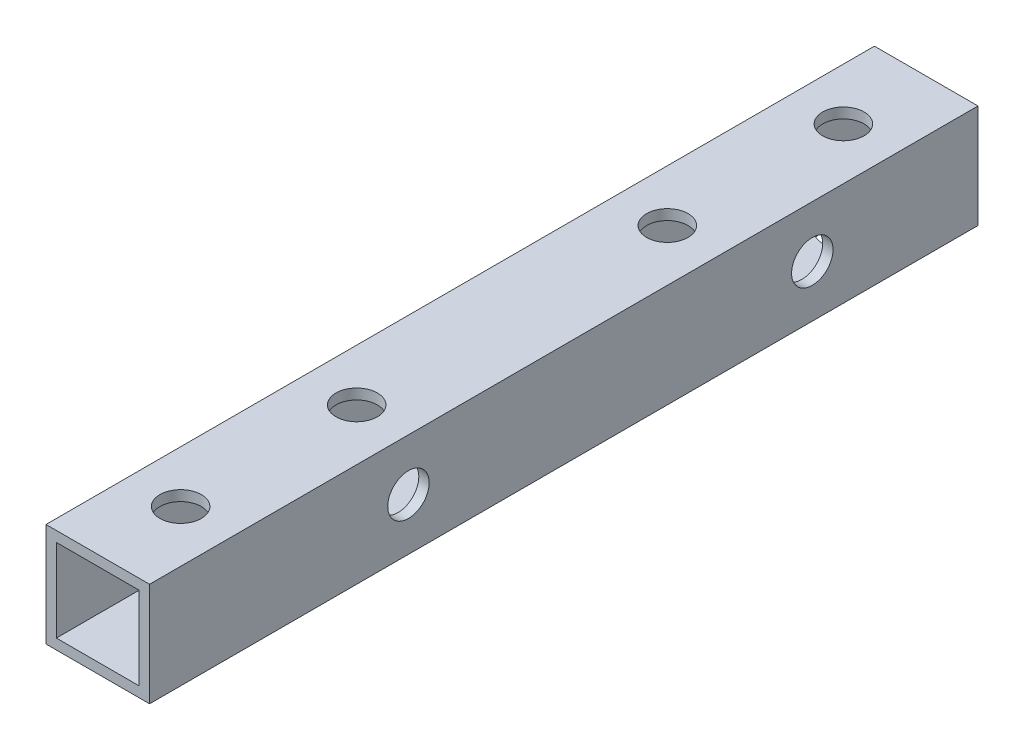
ISO-10303-21;
HEADER;
FILE_DESCRIPTION(('STEP AP214'),'2;1');
FILE_NAME('part.step','',(''),(''),'','','');
FILE_SCHEMA(('AUTOMOTIVE_DESIGN { 1 0 10303 214 1 1 1 1 }'));
ENDSEC;
DATA;
#1=APPLICATION_CONTEXT('core data for automotive mechanical design processes');
#2=APPLICATION_PROTOCOL_DEFINITION('international standard','automotive_design',2000,#1);
#3=PRODUCT_CONTEXT('',#1,'mechanical');
#4=PRODUCT('Part','Part','',(#3));
#5=PRODUCT_RELATED_PRODUCT_CATEGORY('part','',(#4));
#6=PRODUCT_DEFINITION_FORMATION('','',#4);
#7=PRODUCT_DEFINITION_CONTEXT('part definition',#1,'design');
#8=PRODUCT_DEFINITION('design','',#6,#7);
#9=PRODUCT_DEFINITION_SHAPE('','',#8);
#10=(LENGTH_UNIT() NAMED_UNIT(*) SI_UNIT(.MILLI.,.METRE.));
#11=(NAMED_UNIT(*) PLANE_ANGLE_UNIT() SI_UNIT($,.RADIAN.));
#12=(NAMED_UNIT(*) SI_UNIT($,.STERADIAN.) SOLID_ANGLE_UNIT());
#13=UNCERTAINTY_MEASURE_WITH_UNIT(LENGTH_MEASURE(1.E-05),#10,'distance_accuracy_value','');
#14=(GEOMETRIC_REPRESENTATION_CONTEXT(3) GLOBAL_UNCERTAINTY_ASSIGNED_CONTEXT((#13)) GLOBAL_UNIT_ASSIGNED_CONTEXT((#10,
#11,#12)) REPRESENTATION_CONTEXT('',''));
#15=CARTESIAN_POINT('',(0.,0.,0.));
#16=DIRECTION('',(0.,0.,1.));
#17=DIRECTION('',(1.,0.,0.));
#18=AXIS2_PLACEMENT_3D('',#15,#16,#17);
#19=CARTESIAN_POINT('',(0.,0.,80.));
#20=DIRECTION('',(0.,0.,-1.));
#21=DIRECTION('',(-1.,0.,0.));
#22=AXIS2_PLACEMENT_3D('',#19,#20,#21);
#23=PLANE('',#22);
#24=DIRECTION('',(1.,0.,0.));
#25=VECTOR('',#24,1.);
#26=CARTESIAN_POINT('',(10.,0.,80.));
#27=LINE('',#26,#25);
#28=CARTESIAN_POINT('',(0.,0.,80.));
#29=VERTEX_POINT('',#28);
#30=CARTESIAN_POINT('',(10.,0.,80.));
#31=VERTEX_POINT('',#30);
#32=EDGE_CURVE('E139',#29,#31,#27,.T.);
#33=ORIENTED_EDGE('',*,*,#32,.T.);
#34=DIRECTION('',(0.,1.,0.));
#35=VECTOR('',#34,1.);
#36=CARTESIAN_POINT('',(10.,10.,80.));
#37=LINE('',#36,#35);
#38=CARTESIAN_POINT('',(10.,10.,80.));
#39=VERTEX_POINT('',#38);
#40=EDGE_CURVE('E142',#31,#39,#37,.T.);
#41=ORIENTED_EDGE('',*,*,#40,.T.);
#42=DIRECTION('',(-1.,0.,0.));
#43=VECTOR('',#42,1.);
#44=CARTESIAN_POINT('',(0.,10.,80.));
#45=LINE('',#44,#43);
#46=CARTESIAN_POINT('',(0.,10.,80.));
#47=VERTEX_POINT('',#46);
#48=EDGE_CURVE('E145',#39,#47,#45,.T.);
#49=ORIENTED_EDGE('',*,*,#48,.T.);
#50=DIRECTION('',(0.,-1.,0.));
#51=VECTOR('',#50,1.);
#52=CARTESIAN_POINT('',(0.,0.,80.));
#53=LINE('',#52,#51);
#54=EDGE_CURVE('E147',#47,#29,#53,.T.);
#55=ORIENTED_EDGE('',*,*,#54,.T.);
#56=EDGE_LOOP('',(#33,#41,#49,#55));
#57=FACE_BOUND('',#56,.T.);
#58=DIRECTION('',(0.,-1.,0.));
#59=VECTOR('',#58,1.);
#60=CARTESIAN_POINT('',(1.,0.999999999999999,80.));
#61=LINE('',#60,#59);
#62=CARTESIAN_POINT('',(1.,9.,80.));
#63=VERTEX_POINT('',#62);
#64=CARTESIAN_POINT('',(1.,0.999999999999999,80.));
#65=VERTEX_POINT('',#64);
#66=EDGE_CURVE('E101',#63,#65,#61,.T.);
#67=ORIENTED_EDGE('',*,*,#66,.F.);
#68=DIRECTION('',(-1.,0.,0.));
#69=VECTOR('',#68,1.);
#70=CARTESIAN_POINT('',(1.,9.,80.));
#71=LINE('',#70,#69);
#72=CARTESIAN_POINT('',(9.,9.,80.));
#73=VERTEX_POINT('',#72);
#74=EDGE_CURVE('E123',#73,#63,#71,.T.);
#75=ORIENTED_EDGE('',*,*,#74,.F.);
#76=DIRECTION('',(0.,1.,0.));
#77=VECTOR('',#76,1.);
#78=CARTESIAN_POINT('',(9.,9.,80.));
#79=LINE('',#78,#77);
#80=CARTESIAN_POINT('',(9.,1.,80.));
#81=VERTEX_POINT('',#80);
#82=EDGE_CURVE('E121',#81,#73,#79,.T.);
#83=ORIENTED_EDGE('',*,*,#82,.F.);
#84=DIRECTION('',(1.,0.,0.));
#85=VECTOR('',#84,1.);
#86=CARTESIAN_POINT('',(9.,1.,80.));
#87=LINE('',#86,#85);
#88=EDGE_CURVE('E109',#65,#81,#87,.T.);
#89=ORIENTED_EDGE('',*,*,#88,.F.);
#90=EDGE_LOOP('',(#67,#75,#83,#89));
#91=FACE_BOUND('',#90,.T.);
#92=ADVANCED_FACE('F34',(#57,#91),#23,.F.);
#93=CARTESIAN_POINT('',(0.,0.,0.));
#94=DIRECTION('',(0.,0.,-1.));
#95=DIRECTION('',(-1.,0.,0.));
#96=AXIS2_PLACEMENT_3D('',#93,#94,#95);
#97=PLANE('',#96);
#98=DIRECTION('',(1.,0.,0.));
#99=VECTOR('',#98,1.);
#100=CARTESIAN_POINT('',(10.,0.,0.));
#101=LINE('',#100,#99);
#102=CARTESIAN_POINT('',(0.,0.,0.));
#103=VERTEX_POINT('',#102);
#104=CARTESIAN_POINT('',(10.,0.,0.));
#105=VERTEX_POINT('',#104);
#106=EDGE_CURVE('E117',#103,#105,#101,.T.);
#107=ORIENTED_EDGE('',*,*,#106,.F.);
#108=DIRECTION('',(0.,-1.,0.));
#109=VECTOR('',#108,1.);
#110=CARTESIAN_POINT('',(0.,0.,0.));
#111=LINE('',#110,#109);
#112=CARTESIAN_POINT('',(0.,10.,0.));
#113=VERTEX_POINT('',#112);
#114=EDGE_CURVE('E143',#113,#103,#111,.T.);
#115=ORIENTED_EDGE('',*,*,#114,.F.);
#116=DIRECTION('',(-1.,0.,0.));
#117=VECTOR('',#116,1.);
#118=CARTESIAN_POINT('',(0.,10.,0.));
#119=LINE('',#118,#117);
#120=CARTESIAN_POINT('',(10.,10.,0.));
#121=VERTEX_POINT('',#120);
#122=EDGE_CURVE('E154',#121,#113,#119,.T.);
#123=ORIENTED_EDGE('',*,*,#122,.F.);
#124=DIRECTION('',(0.,1.,0.));
#125=VECTOR('',#124,1.);
#126=CARTESIAN_POINT('',(10.,10.,0.));
#127=LINE('',#126,#125);
#128=EDGE_CURVE('E152',#105,#121,#127,.T.);
#129=ORIENTED_EDGE('',*,*,#128,.F.);
#130=EDGE_LOOP('',(#107,#115,#123,#129));
#131=FACE_BOUND('',#130,.T.);
#132=DIRECTION('',(-1.,0.,0.));
#133=VECTOR('',#132,1.);
#134=CARTESIAN_POINT('',(1.,9.,0.));
#135=LINE('',#134,#133);
#136=CARTESIAN_POINT('',(9.,9.,0.));
#137=VERTEX_POINT('',#136);
#138=CARTESIAN_POINT('',(1.,9.,0.));
#139=VERTEX_POINT('',#138);
#140=EDGE_CURVE('E110',#137,#139,#135,.T.);
#141=ORIENTED_EDGE('',*,*,#140,.T.);
#142=DIRECTION('',(0.,-1.,0.));
#143=VECTOR('',#142,1.);
#144=CARTESIAN_POINT('',(1.,0.999999999999999,0.));
#145=LINE('',#144,#143);
#146=CARTESIAN_POINT('',(1.,0.999999999999999,0.));
#147=VERTEX_POINT('',#146);
#148=EDGE_CURVE('E59',#139,#147,#145,.T.);
#149=ORIENTED_EDGE('',*,*,#148,.T.);
#150=DIRECTION('',(1.,0.,0.));
#151=VECTOR('',#150,1.);
#152=CARTESIAN_POINT('',(9.,1.,0.));
#153=LINE('',#152,#151);
#154=CARTESIAN_POINT('',(9.,1.,0.));
#155=VERTEX_POINT('',#154);
#156=EDGE_CURVE('E116',#147,#155,#153,.T.);
#157=ORIENTED_EDGE('',*,*,#156,.T.);
#158=DIRECTION('',(0.,1.,0.));
#159=VECTOR('',#158,1.);
#160=CARTESIAN_POINT('',(9.,9.,0.));
#161=LINE('',#160,#159);
#162=EDGE_CURVE('E131',#155,#137,#161,.T.);
#163=ORIENTED_EDGE('',*,*,#162,.T.);
#164=EDGE_LOOP('',(#141,#149,#157,#163));
#165=FACE_BOUND('',#164,.T.);
#166=ADVANCED_FACE('F252',(#131,#165),#97,.T.);
#167=CARTESIAN_POINT('',(10.,0.,80.));
#168=DIRECTION('',(0.,1.,0.));
#169=DIRECTION('',(-1.,0.,0.));
#170=AXIS2_PLACEMENT_3D('',#167,#168,#169);
#171=PLANE('',#170);
#172=CARTESIAN_POINT('',(5.,0.,55.));
#173=DIRECTION('',(0.,-1.,0.));
#174=DIRECTION('',(1.,0.,0.));
#175=AXIS2_PLACEMENT_3D('',#172,#173,#174);
#176=CIRCLE('',#175,2.);
#177=CARTESIAN_POINT('',(7.,0.,55.));
#178=VERTEX_POINT('',#177);
#179=EDGE_CURVE('E182',#178,#178,#176,.T.);
#180=ORIENTED_EDGE('',*,*,#179,.F.);
#181=EDGE_LOOP('',(#180));
#182=FACE_BOUND('',#181,.T.);
#183=CARTESIAN_POINT('',(5.,0.,25.));
#184=DIRECTION('',(0.,-1.,0.));
#185=DIRECTION('',(1.,0.,0.));
#186=AXIS2_PLACEMENT_3D('',#183,#184,#185);
#187=CIRCLE('',#186,2.);
#188=CARTESIAN_POINT('',(7.,0.,25.));
#189=VERTEX_POINT('',#188);
#190=EDGE_CURVE('E178',#189,#189,#187,.T.);
#191=ORIENTED_EDGE('',*,*,#190,.F.);
#192=EDGE_LOOP('',(#191));
#193=FACE_BOUND('',#192,.T.);
#194=CARTESIAN_POINT('',(5.,0.,72.));
#195=DIRECTION('',(0.,1.,0.));
#196=DIRECTION('',(-1.,0.,0.));
#197=AXIS2_PLACEMENT_3D('',#194,#195,#196);
#198=CIRCLE('',#197,2.);
#199=CARTESIAN_POINT('',(3.,0.,72.));
#200=VERTEX_POINT('',#199);
#201=EDGE_CURVE('E129',#200,#200,#198,.T.);
#202=ORIENTED_EDGE('',*,*,#201,.T.);
#203=EDGE_LOOP('',(#202));
#204=FACE_BOUND('',#203,.T.);
#205=CARTESIAN_POINT('',(5.00000000000001,0.,8.));
#206=DIRECTION('',(0.,1.,0.));
#207=DIRECTION('',(-1.,0.,0.));
#208=AXIS2_PLACEMENT_3D('',#205,#206,#207);
#209=CIRCLE('',#208,2.);
#210=CARTESIAN_POINT('',(3.,0.,8.));
#211=VERTEX_POINT('',#210);
#212=EDGE_CURVE('E173',#211,#211,#209,.T.);
#213=ORIENTED_EDGE('',*,*,#212,.T.);
#214=EDGE_LOOP('',(#213));
#215=FACE_BOUND('',#214,.T.);
#216=ORIENTED_EDGE('',*,*,#106,.T.);
#217=DIRECTION('',(0.,0.,-1.));
#218=VECTOR('',#217,1.);
#219=CARTESIAN_POINT('',(10.,0.,80.));
#220=LINE('',#219,#218);
#221=EDGE_CURVE('E11',#31,#105,#220,.T.);
#222=ORIENTED_EDGE('',*,*,#221,.F.);
#223=ORIENTED_EDGE('',*,*,#32,.F.);
#224=DIRECTION('',(0.,0.,-1.));
#225=VECTOR('',#224,1.);
#226=CARTESIAN_POINT('',(0.,0.,80.));
#227=LINE('',#226,#225);
#228=EDGE_CURVE('E149',#29,#103,#227,.T.);
#229=ORIENTED_EDGE('',*,*,#228,.T.);
#230=EDGE_LOOP('',(#216,#222,#223,#229));
#231=FACE_BOUND('',#230,.T.);
#232=ADVANCED_FACE('F36',(#182,#193,#204,#215,#231),#171,.F.);
#233=CARTESIAN_POINT('',(10.,10.,80.));
#234=DIRECTION('',(-1.,0.,0.));
#235=DIRECTION('',(0.,-1.,0.));
#236=AXIS2_PLACEMENT_3D('',#233,#234,#235);
#237=PLANE('',#236);
#238=CARTESIAN_POINT('',(10.,5.,55.));
#239=DIRECTION('',(-1.,0.,0.));
#240=DIRECTION('',(0.,-1.,0.));
#241=AXIS2_PLACEMENT_3D('',#238,#239,#240);
#242=CIRCLE('',#241,2.);
#243=CARTESIAN_POINT('',(10.,3.00000000000001,55.));
#244=VERTEX_POINT('',#243);
#245=EDGE_CURVE('E281',#244,#244,#242,.T.);
#246=ORIENTED_EDGE('',*,*,#245,.T.);
#247=EDGE_LOOP('',(#246));
#248=FACE_BOUND('',#247,.T.);
#249=CARTESIAN_POINT('',(10.,5.,16.));
#250=DIRECTION('',(1.,0.,0.));
#251=DIRECTION('',(0.,1.,0.));
#252=AXIS2_PLACEMENT_3D('',#249,#250,#251);
#253=CIRCLE('',#252,2.);
#254=CARTESIAN_POINT('',(10.,7.,16.));
#255=VERTEX_POINT('',#254);
#256=EDGE_CURVE('E186',#255,#255,#253,.T.);
#257=ORIENTED_EDGE('',*,*,#256,.F.);
#258=EDGE_LOOP('',(#257));
#259=FACE_BOUND('',#258,.T.);
#260=ORIENTED_EDGE('',*,*,#128,.T.);
#261=DIRECTION('',(0.,0.,-1.));
#262=VECTOR('',#261,1.);
#263=CARTESIAN_POINT('',(10.,10.,80.));
#264=LINE('',#263,#262);
#265=EDGE_CURVE('E43',#39,#121,#264,.T.);
#266=ORIENTED_EDGE('',*,*,#265,.F.);
#267=ORIENTED_EDGE('',*,*,#40,.F.);
#268=ORIENTED_EDGE('',*,*,#221,.T.);
#269=EDGE_LOOP('',(#260,#266,#267,#268));
#270=FACE_BOUND('',#269,.T.);
#271=ADVANCED_FACE('F269',(#248,#259,#270),#237,.F.);
#272=CARTESIAN_POINT('',(0.,10.,80.));
#273=DIRECTION('',(0.,-1.,0.));
#274=DIRECTION('',(1.,0.,0.));
#275=AXIS2_PLACEMENT_3D('',#272,#273,#274);
#276=PLANE('',#275);
#277=CARTESIAN_POINT('',(5.,9.99999999999999,55.));
#278=DIRECTION('',(0.,-1.,0.));
#279=DIRECTION('',(1.,0.,0.));
#280=AXIS2_PLACEMENT_3D('',#277,#278,#279);
#281=CIRCLE('',#280,2.);
#282=CARTESIAN_POINT('',(7.,9.99999999999998,55.));
#283=VERTEX_POINT('',#282);
#284=EDGE_CURVE('E207',#283,#283,#281,.T.);
#285=ORIENTED_EDGE('',*,*,#284,.T.);
#286=EDGE_LOOP('',(#285));
#287=FACE_BOUND('',#286,.T.);
#288=CARTESIAN_POINT('',(5.,9.99999999999999,25.));
#289=DIRECTION('',(0.,-1.,0.));
#290=DIRECTION('',(1.,0.,0.));
#291=AXIS2_PLACEMENT_3D('',#288,#289,#290);
#292=CIRCLE('',#291,2.);
#293=CARTESIAN_POINT('',(7.,9.99999999999998,25.));
#294=VERTEX_POINT('',#293);
#295=EDGE_CURVE('E214',#294,#294,#292,.T.);
#296=ORIENTED_EDGE('',*,*,#295,.T.);
#297=EDGE_LOOP('',(#296));
#298=FACE_BOUND('',#297,.T.);
#299=CARTESIAN_POINT('',(5.,10.,72.));
#300=DIRECTION('',(0.,1.,0.));
#301=DIRECTION('',(-1.,0.,0.));
#302=AXIS2_PLACEMENT_3D('',#299,#300,#301);
#303=CIRCLE('',#302,2.);
#304=CARTESIAN_POINT('',(3.,10.,72.));
#305=VERTEX_POINT('',#304);
#306=EDGE_CURVE('E168',#305,#305,#303,.T.);
#307=ORIENTED_EDGE('',*,*,#306,.F.);
#308=EDGE_LOOP('',(#307));
#309=FACE_BOUND('',#308,.T.);
#310=CARTESIAN_POINT('',(5.,10.,8.));
#311=DIRECTION('',(0.,1.,0.));
#312=DIRECTION('',(-1.,0.,0.));
#313=AXIS2_PLACEMENT_3D('',#310,#311,#312);
#314=CIRCLE('',#313,2.);
#315=CARTESIAN_POINT('',(3.,10.,8.));
#316=VERTEX_POINT('',#315);
#317=EDGE_CURVE('E217',#316,#316,#314,.T.);
#318=ORIENTED_EDGE('',*,*,#317,.F.);
#319=EDGE_LOOP('',(#318));
#320=FACE_BOUND('',#319,.T.);
#321=ORIENTED_EDGE('',*,*,#122,.T.);
#322=DIRECTION('',(0.,0.,-1.));
#323=VECTOR('',#322,1.);
#324=CARTESIAN_POINT('',(0.,10.,80.));
#325=LINE('',#324,#323);
#326=EDGE_CURVE('E159',#47,#113,#325,.T.);
#327=ORIENTED_EDGE('',*,*,#326,.F.);
#328=ORIENTED_EDGE('',*,*,#48,.F.);
#329=ORIENTED_EDGE('',*,*,#265,.T.);
#330=EDGE_LOOP('',(#321,#327,#328,#329));
#331=FACE_BOUND('',#330,.T.);
#332=ADVANCED_FACE('F266',(#287,#298,#309,#320,#331),#276,.F.);
#333=CARTESIAN_POINT('',(0.,0.,80.));
#334=DIRECTION('',(1.,0.,0.));
#335=DIRECTION('',(0.,1.,0.));
#336=AXIS2_PLACEMENT_3D('',#333,#334,#335);
#337=PLANE('',#336);
#338=CARTESIAN_POINT('',(0.,5.,55.));
#339=DIRECTION('',(-1.,0.,0.));
#340=DIRECTION('',(0.,-1.,0.));
#341=AXIS2_PLACEMENT_3D('',#338,#339,#340);
#342=CIRCLE('',#341,2.);
#343=CARTESIAN_POINT('',(0.,3.00000000000001,55.));
#344=VERTEX_POINT('',#343);
#345=EDGE_CURVE('E359',#344,#344,#342,.T.);
#346=ORIENTED_EDGE('',*,*,#345,.F.);
#347=EDGE_LOOP('',(#346));
#348=FACE_BOUND('',#347,.T.);
#349=CARTESIAN_POINT('',(0.,5.,16.));
#350=DIRECTION('',(1.,0.,0.));
#351=DIRECTION('',(0.,1.,0.));
#352=AXIS2_PLACEMENT_3D('',#349,#350,#351);
#353=CIRCLE('',#352,2.);
#354=CARTESIAN_POINT('',(0.,7.,16.));
#355=VERTEX_POINT('',#354);
#356=EDGE_CURVE('E190',#355,#355,#353,.T.);
#357=ORIENTED_EDGE('',*,*,#356,.T.);
#358=EDGE_LOOP('',(#357));
#359=FACE_BOUND('',#358,.T.);
#360=ORIENTED_EDGE('',*,*,#114,.T.);
#361=ORIENTED_EDGE('',*,*,#228,.F.);
#362=ORIENTED_EDGE('',*,*,#54,.F.);
#363=ORIENTED_EDGE('',*,*,#326,.T.);
#364=EDGE_LOOP('',(#360,#361,#362,#363));
#365=FACE_BOUND('',#364,.T.);
#366=ADVANCED_FACE('F263',(#348,#359,#365),#337,.F.);
#367=CARTESIAN_POINT('',(1.,0.999999999999999,80.));
#368=DIRECTION('',(1.,0.,0.));
#369=DIRECTION('',(0.,1.,0.));
#370=AXIS2_PLACEMENT_3D('',#367,#368,#369);
#371=PLANE('',#370);
#372=CARTESIAN_POINT('',(1.,5.,55.));
#373=DIRECTION('',(1.,0.,0.));
#374=DIRECTION('',(0.,1.,0.));
#375=AXIS2_PLACEMENT_3D('',#372,#373,#374);
#376=CIRCLE('',#375,2.);
#377=CARTESIAN_POINT('',(1.,7.,55.));
#378=VERTEX_POINT('',#377);
#379=EDGE_CURVE('E193',#378,#378,#376,.T.);
#380=ORIENTED_EDGE('',*,*,#379,.F.);
#381=EDGE_LOOP('',(#380));
#382=FACE_BOUND('',#381,.T.);
#383=CARTESIAN_POINT('',(1.,5.,16.));
#384=DIRECTION('',(1.,0.,0.));
#385=DIRECTION('',(0.,1.,0.));
#386=AXIS2_PLACEMENT_3D('',#383,#384,#385);
#387=CIRCLE('',#386,2.);
#388=CARTESIAN_POINT('',(1.,7.,16.));
#389=VERTEX_POINT('',#388);
#390=EDGE_CURVE('E185',#389,#389,#387,.T.);
#391=ORIENTED_EDGE('',*,*,#390,.F.);
#392=EDGE_LOOP('',(#391));
#393=FACE_BOUND('',#392,.T.);
#394=ORIENTED_EDGE('',*,*,#148,.F.);
#395=DIRECTION('',(0.,0.,-1.));
#396=VECTOR('',#395,1.);
#397=CARTESIAN_POINT('',(1.,9.,80.));
#398=LINE('',#397,#396);
#399=EDGE_CURVE('E105',#63,#139,#398,.T.);
#400=ORIENTED_EDGE('',*,*,#399,.F.);
#401=ORIENTED_EDGE('',*,*,#66,.T.);
#402=DIRECTION('',(0.,0.,-1.));
#403=VECTOR('',#402,1.);
#404=CARTESIAN_POINT('',(1.,0.999999999999999,80.));
#405=LINE('',#404,#403);
#406=EDGE_CURVE('E104',#65,#147,#405,.T.);
#407=ORIENTED_EDGE('',*,*,#406,.T.);
#408=EDGE_LOOP('',(#394,#400,#401,#407));
#409=FACE_BOUND('',#408,.T.);
#410=ADVANCED_FACE('F103',(#382,#393,#409),#371,.T.);
#411=CARTESIAN_POINT('',(9.,1.,80.));
#412=DIRECTION('',(0.,1.,0.));
#413=DIRECTION('',(-1.,0.,0.));
#414=AXIS2_PLACEMENT_3D('',#411,#412,#413);
#415=PLANE('',#414);
#416=CARTESIAN_POINT('',(5.,1.,55.));
#417=DIRECTION('',(0.,1.,0.));
#418=DIRECTION('',(-1.,0.,0.));
#419=AXIS2_PLACEMENT_3D('',#416,#417,#418);
#420=CIRCLE('',#419,2.);
#421=CARTESIAN_POINT('',(7.,1.,55.));
#422=VERTEX_POINT('',#421);
#423=EDGE_CURVE('E181',#422,#422,#420,.T.);
#424=ORIENTED_EDGE('',*,*,#423,.F.);
#425=EDGE_LOOP('',(#424));
#426=FACE_BOUND('',#425,.T.);
#427=CARTESIAN_POINT('',(5.,1.,25.));
#428=DIRECTION('',(0.,1.,0.));
#429=DIRECTION('',(-1.,0.,0.));
#430=AXIS2_PLACEMENT_3D('',#427,#428,#429);
#431=CIRCLE('',#430,2.);
#432=CARTESIAN_POINT('',(7.,1.,25.));
#433=VERTEX_POINT('',#432);
#434=EDGE_CURVE('E177',#433,#433,#431,.T.);
#435=ORIENTED_EDGE('',*,*,#434,.F.);
#436=EDGE_LOOP('',(#435));
#437=FACE_BOUND('',#436,.T.);
#438=CARTESIAN_POINT('',(5.,1.,72.));
#439=DIRECTION('',(0.,1.,0.));
#440=DIRECTION('',(-1.,0.,0.));
#441=AXIS2_PLACEMENT_3D('',#438,#439,#440);
#442=CIRCLE('',#441,2.);
#443=CARTESIAN_POINT('',(3.,1.,72.));
#444=VERTEX_POINT('',#443);
#445=EDGE_CURVE('E172',#444,#444,#442,.T.);
#446=ORIENTED_EDGE('',*,*,#445,.F.);
#447=EDGE_LOOP('',(#446));
#448=FACE_BOUND('',#447,.T.);
#449=CARTESIAN_POINT('',(5.00000000000001,1.,8.));
#450=DIRECTION('',(0.,1.,0.));
#451=DIRECTION('',(-1.,0.,0.));
#452=AXIS2_PLACEMENT_3D('',#449,#450,#451);
#453=CIRCLE('',#452,2.);
#454=CARTESIAN_POINT('',(3.,1.,8.));
#455=VERTEX_POINT('',#454);
#456=EDGE_CURVE('E167',#455,#455,#453,.T.);
#457=ORIENTED_EDGE('',*,*,#456,.F.);
#458=EDGE_LOOP('',(#457));
#459=FACE_BOUND('',#458,.T.);
#460=ORIENTED_EDGE('',*,*,#156,.F.);
#461=ORIENTED_EDGE('',*,*,#406,.F.);
#462=ORIENTED_EDGE('',*,*,#88,.T.);
#463=DIRECTION('',(0.,0.,-1.));
#464=VECTOR('',#463,1.);
#465=CARTESIAN_POINT('',(9.,1.,80.));
#466=LINE('',#465,#464);
#467=EDGE_CURVE('E118',#81,#155,#466,.T.);
#468=ORIENTED_EDGE('',*,*,#467,.T.);
#469=EDGE_LOOP('',(#460,#461,#462,#468));
#470=FACE_BOUND('',#469,.T.);
#471=ADVANCED_FACE('F113',(#426,#437,#448,#459,#470),#415,.T.);
#472=CARTESIAN_POINT('',(9.,9.,80.));
#473=DIRECTION('',(-1.,0.,0.));
#474=DIRECTION('',(0.,0.,1.));
#475=AXIS2_PLACEMENT_3D('',#472,#473,#474);
#476=PLANE('',#475);
#477=CARTESIAN_POINT('',(9.,5.,55.));
#478=DIRECTION('',(-1.,0.,0.));
#479=DIRECTION('',(0.,0.,1.));
#480=AXIS2_PLACEMENT_3D('',#477,#478,#479);
#481=CIRCLE('',#480,2.);
#482=CARTESIAN_POINT('',(9.,5.,57.));
#483=VERTEX_POINT('',#482);
#484=EDGE_CURVE('E38',#483,#483,#481,.T.);
#485=ORIENTED_EDGE('',*,*,#484,.F.);
#486=EDGE_LOOP('',(#485));
#487=FACE_BOUND('',#486,.T.);
#488=CARTESIAN_POINT('',(8.99999999999999,5.,16.));
#489=DIRECTION('',(-1.,0.,0.));
#490=DIRECTION('',(0.,0.,1.));
#491=AXIS2_PLACEMENT_3D('',#488,#489,#490);
#492=CIRCLE('',#491,2.);
#493=CARTESIAN_POINT('',(8.99999999999999,5.,18.));
#494=VERTEX_POINT('',#493);
#495=EDGE_CURVE('E183',#494,#494,#492,.T.);
#496=ORIENTED_EDGE('',*,*,#495,.F.);
#497=EDGE_LOOP('',(#496));
#498=FACE_BOUND('',#497,.T.);
#499=ORIENTED_EDGE('',*,*,#162,.F.);
#500=ORIENTED_EDGE('',*,*,#467,.F.);
#501=ORIENTED_EDGE('',*,*,#82,.T.);
#502=DIRECTION('',(0.,0.,-1.));
#503=VECTOR('',#502,1.);
#504=CARTESIAN_POINT('',(9.,9.,80.));
#505=LINE('',#504,#503);
#506=EDGE_CURVE('E51',#73,#137,#505,.T.);
#507=ORIENTED_EDGE('',*,*,#506,.T.);
#508=EDGE_LOOP('',(#499,#500,#501,#507));
#509=FACE_BOUND('',#508,.T.);
#510=ADVANCED_FACE('F300',(#487,#498,#509),#476,.T.);
#511=CARTESIAN_POINT('',(1.,9.,80.));
#512=DIRECTION('',(0.,-1.,0.));
#513=DIRECTION('',(0.,0.,-1.));
#514=AXIS2_PLACEMENT_3D('',#511,#512,#513);
#515=PLANE('',#514);
#516=CARTESIAN_POINT('',(5.,8.99999999999999,55.));
#517=DIRECTION('',(0.,-1.,0.));
#518=DIRECTION('',(0.,0.,-1.));
#519=AXIS2_PLACEMENT_3D('',#516,#517,#518);
#520=CIRCLE('',#519,2.);
#521=CARTESIAN_POINT('',(7.,9.00000000000001,55.));
#522=VERTEX_POINT('',#521);
#523=EDGE_CURVE('E179',#522,#522,#520,.T.);
#524=ORIENTED_EDGE('',*,*,#523,.F.);
#525=EDGE_LOOP('',(#524));
#526=FACE_BOUND('',#525,.T.);
#527=CARTESIAN_POINT('',(5.,8.99999999999999,25.));
#528=DIRECTION('',(0.,-1.,0.));
#529=DIRECTION('',(0.,0.,-1.));
#530=AXIS2_PLACEMENT_3D('',#527,#528,#529);
#531=CIRCLE('',#530,2.);
#532=CARTESIAN_POINT('',(7.,9.00000000000001,25.));
#533=VERTEX_POINT('',#532);
#534=EDGE_CURVE('E174',#533,#533,#531,.T.);
#535=ORIENTED_EDGE('',*,*,#534,.F.);
#536=EDGE_LOOP('',(#535));
#537=FACE_BOUND('',#536,.T.);
#538=CARTESIAN_POINT('',(5.,9.,72.));
#539=DIRECTION('',(0.,-1.,0.));
#540=DIRECTION('',(0.,0.,-1.));
#541=AXIS2_PLACEMENT_3D('',#538,#539,#540);
#542=CIRCLE('',#541,2.);
#543=CARTESIAN_POINT('',(5.,9.,70.));
#544=VERTEX_POINT('',#543);
#545=EDGE_CURVE('E169',#544,#544,#542,.T.);
#546=ORIENTED_EDGE('',*,*,#545,.F.);
#547=EDGE_LOOP('',(#546));
#548=FACE_BOUND('',#547,.T.);
#549=CARTESIAN_POINT('',(5.,9.,8.));
#550=DIRECTION('',(0.,-1.,0.));
#551=DIRECTION('',(0.,0.,-1.));
#552=AXIS2_PLACEMENT_3D('',#549,#550,#551);
#553=CIRCLE('',#552,2.);
#554=CARTESIAN_POINT('',(5.,9.,6.));
#555=VERTEX_POINT('',#554);
#556=EDGE_CURVE('E164',#555,#555,#553,.T.);
#557=ORIENTED_EDGE('',*,*,#556,.F.);
#558=EDGE_LOOP('',(#557));
#559=FACE_BOUND('',#558,.T.);
#560=ORIENTED_EDGE('',*,*,#140,.F.);
#561=ORIENTED_EDGE('',*,*,#506,.F.);
#562=ORIENTED_EDGE('',*,*,#74,.T.);
#563=ORIENTED_EDGE('',*,*,#399,.T.);
#564=EDGE_LOOP('',(#560,#561,#562,#563));
#565=FACE_BOUND('',#564,.T.);
#566=ADVANCED_FACE('F298',(#526,#537,#548,#559,#565),#515,.T.);
#567=CARTESIAN_POINT('',(5.00000000000002,-60.,8.));
#568=DIRECTION('',(0.,1.,0.));
#569=DIRECTION('',(-1.,0.,0.));
#570=AXIS2_PLACEMENT_3D('',#567,#568,#569);
#571=CYLINDRICAL_SURFACE('',#570,2.);
#572=ORIENTED_EDGE('',*,*,#556,.T.);
#573=EDGE_LOOP('',(#572));
#574=FACE_BOUND('',#573,.T.);
#575=ORIENTED_EDGE('',*,*,#317,.T.);
#576=EDGE_LOOP('',(#575));
#577=FACE_BOUND('',#576,.T.);
#578=ADVANCED_FACE('F248',(#574,#577),#571,.F.);
#579=CARTESIAN_POINT('',(5.00000000000001,-60.,72.));
#580=DIRECTION('',(0.,1.,0.));
#581=DIRECTION('',(-1.,0.,0.));
#582=AXIS2_PLACEMENT_3D('',#579,#580,#581);
#583=CYLINDRICAL_SURFACE('',#582,2.);
#584=ORIENTED_EDGE('',*,*,#545,.T.);
#585=EDGE_LOOP('',(#584));
#586=FACE_BOUND('',#585,.T.);
#587=ORIENTED_EDGE('',*,*,#306,.T.);
#588=EDGE_LOOP('',(#587));
#589=FACE_BOUND('',#588,.T.);
#590=ADVANCED_FACE('F238',(#586,#589),#583,.F.);
#591=ORIENTED_EDGE('',*,*,#456,.T.);
#592=EDGE_LOOP('',(#591));
#593=FACE_BOUND('',#592,.T.);
#594=ORIENTED_EDGE('',*,*,#212,.F.);
#595=EDGE_LOOP('',(#594));
#596=FACE_BOUND('',#595,.T.);
#597=ADVANCED_FACE('F235',(#593,#596),#571,.F.);
#598=ORIENTED_EDGE('',*,*,#445,.T.);
#599=EDGE_LOOP('',(#598));
#600=FACE_BOUND('',#599,.T.);
#601=ORIENTED_EDGE('',*,*,#201,.F.);
#602=EDGE_LOOP('',(#601));
#603=FACE_BOUND('',#602,.T.);
#604=ADVANCED_FACE('F232',(#600,#603),#583,.F.);
#605=CARTESIAN_POINT('',(4.99999999999999,104.,25.));
#606=DIRECTION('',(0.,-1.,0.));
#607=DIRECTION('',(1.,0.,0.));
#608=AXIS2_PLACEMENT_3D('',#605,#606,#607);
#609=CYLINDRICAL_SURFACE('',#608,2.);
#610=CARTESIAN_POINT('',(7.,9.00000000000001,25.));
#611=CARTESIAN_POINT('',(7.,9.01041666666667,25.));
#612=CARTESIAN_POINT('',(7.,9.02083333333334,25.));
#613=CARTESIAN_POINT('',(7.,9.04166666666667,25.));
#614=CARTESIAN_POINT('',(7.,9.05208333333334,25.));
#615=CARTESIAN_POINT('',(7.,9.07291666666667,25.));
#616=CARTESIAN_POINT('',(7.,9.08333333333334,25.));
#617=CARTESIAN_POINT('',(7.,9.10416666666668,25.));
#618=CARTESIAN_POINT('',(7.,9.11458333333334,25.));
#619=CARTESIAN_POINT('',(7.,9.13541666666667,25.));
#620=CARTESIAN_POINT('',(7.,9.14583333333334,25.));
#621=CARTESIAN_POINT('',(7.,9.16666666666667,25.));
#622=CARTESIAN_POINT('',(7.,9.17708333333334,25.));
#623=CARTESIAN_POINT('',(7.,9.19791666666667,25.));
#624=CARTESIAN_POINT('',(7.,9.20833333333333,25.));
#625=CARTESIAN_POINT('',(7.,9.22916666666667,25.));
#626=CARTESIAN_POINT('',(7.,9.23958333333334,25.));
#627=CARTESIAN_POINT('',(7.,9.26041666666667,25.));
#628=CARTESIAN_POINT('',(7.,9.27083333333334,25.));
#629=CARTESIAN_POINT('',(7.,9.29166666666667,25.));
#630=CARTESIAN_POINT('',(7.,9.30208333333334,25.));
#631=CARTESIAN_POINT('',(7.,9.32291666666667,25.));
#632=CARTESIAN_POINT('',(7.,9.33333333333333,25.));
#633=CARTESIAN_POINT('',(7.,9.35416666666666,25.));
#634=CARTESIAN_POINT('',(7.,9.36458333333333,25.));
#635=CARTESIAN_POINT('',(7.,9.38541666666666,25.));
#636=CARTESIAN_POINT('',(7.,9.39583333333333,25.));
#637=CARTESIAN_POINT('',(7.,9.41666666666666,25.));
#638=CARTESIAN_POINT('',(7.,9.42708333333333,25.));
#639=CARTESIAN_POINT('',(7.,9.44791666666667,25.));
#640=CARTESIAN_POINT('',(7.,9.45833333333333,25.));
#641=CARTESIAN_POINT('',(7.,9.47916666666666,25.));
#642=CARTESIAN_POINT('',(7.,9.48958333333333,25.));
#643=CARTESIAN_POINT('',(7.,9.51041666666666,25.));
#644=CARTESIAN_POINT('',(7.,9.52083333333333,25.));
#645=CARTESIAN_POINT('',(7.,9.54166666666666,25.));
#646=CARTESIAN_POINT('',(7.,9.55208333333332,25.));
#647=CARTESIAN_POINT('',(7.,9.57291666666666,25.));
#648=CARTESIAN_POINT('',(7.,9.58333333333333,25.));
#649=CARTESIAN_POINT('',(7.,9.60416666666666,25.));
#650=CARTESIAN_POINT('',(7.,9.61458333333333,25.));
#651=CARTESIAN_POINT('',(7.,9.63541666666666,25.));
#652=CARTESIAN_POINT('',(7.,9.64583333333333,25.));
#653=CARTESIAN_POINT('',(7.,9.66666666666666,25.));
#654=CARTESIAN_POINT('',(7.,9.67708333333332,25.));
#655=CARTESIAN_POINT('',(7.,9.69791666666665,25.));
#656=CARTESIAN_POINT('',(7.,9.70833333333332,25.));
#657=CARTESIAN_POINT('',(7.,9.72916666666665,25.));
#658=CARTESIAN_POINT('',(7.,9.73958333333332,25.));
#659=CARTESIAN_POINT('',(7.,9.76041666666665,25.));
#660=CARTESIAN_POINT('',(7.,9.77083333333332,25.));
#661=CARTESIAN_POINT('',(7.,9.79166666666666,25.));
#662=CARTESIAN_POINT('',(7.,9.80208333333332,25.));
#663=CARTESIAN_POINT('',(7.,9.82291666666665,25.));
#664=CARTESIAN_POINT('',(7.,9.83333333333332,25.));
#665=CARTESIAN_POINT('',(7.,9.85416666666665,25.));
#666=CARTESIAN_POINT('',(7.,9.86458333333332,25.));
#667=CARTESIAN_POINT('',(7.,9.88541666666665,25.));
#668=CARTESIAN_POINT('',(7.,9.89583333333331,25.));
#669=CARTESIAN_POINT('',(7.,9.91666666666665,25.));
#670=CARTESIAN_POINT('',(7.,9.92708333333332,25.));
#671=CARTESIAN_POINT('',(7.,9.94791666666665,25.));
#672=CARTESIAN_POINT('',(7.,9.95833333333332,25.));
#673=CARTESIAN_POINT('',(7.,9.97916666666665,25.));
#674=CARTESIAN_POINT('',(7.,9.98958333333332,25.));
#675=CARTESIAN_POINT('',(7.,9.99999999999998,25.));
#676=B_SPLINE_CURVE_WITH_KNOTS('',3,(#610,#611,#612,#613,#614,#615,#616,#617,#618,#619,#620,
#621,#622,#623,#624,#625,#626,#627,#628,#629,#630,#631,#632,#633,#634,#635,#636,#637,#638,#639,
#640,#641,#642,#643,#644,#645,#646,#647,#648,#649,#650,#651,#652,#653,#654,#655,#656,#657,#658,
#659,#660,#661,#662,#663,#664,#665,#666,#667,#668,#669,#670,#671,#672,#673,#674,#675),
.UNSPECIFIED.,.F.,.F.,(4,2,2,2,2,2,2,2,2,2,2,2,2,2,2,2,2,2,2,2,2,2,2,2,2,2,2,2,2,2,2,2,4),(0.,
0.0312499999999966,0.0624999999999931,0.0937500000000036,0.125,0.156249999999997,
0.187499999999993,0.21874999999999,0.25,0.281249999999997,0.312499999999993,0.34374999999999,
0.374999999999986,0.406249999999983,0.437499999999993,0.46874999999999,0.499999999999987,
0.531249999999983,0.56249999999998,0.59374999999999,0.624999999999987,0.656249999999983,
0.68749999999998,0.718749999999976,0.749999999999973,0.781249999999983,0.81249999999998,
0.843749999999976,0.874999999999973,0.90624999999997,0.93749999999998,0.968749999999977,
0.999999999999973),.UNSPECIFIED.);
#677=EDGE_CURVE('BSEAM234',#533,#294,#676,.T.);
#678=ORIENTED_EDGE('',*,*,#534,.T.);
#679=ORIENTED_EDGE('',*,*,#295,.F.);
#680=ORIENTED_EDGE('',*,*,#677,.T.);
#681=ORIENTED_EDGE('',*,*,#677,.F.);
#682=EDGE_LOOP('',(#678,#680,#679,#681));
#683=FACE_BOUND('',#682,.T.);
#684=ADVANCED_FACE('F234',(#683),#609,.F.);
#685=CARTESIAN_POINT('',(7.,1.,25.));
#686=CARTESIAN_POINT('',(7.,0.989583333333335,25.));
#687=CARTESIAN_POINT('',(7.,0.97916666666667,25.));
#688=CARTESIAN_POINT('',(7.,0.958333333333339,25.));
#689=CARTESIAN_POINT('',(7.,0.947916666666673,25.));
#690=CARTESIAN_POINT('',(7.,0.927083333333338,25.));
#691=CARTESIAN_POINT('',(7.,0.916666666666668,25.));
#692=CARTESIAN_POINT('',(7.,0.895833333333332,25.));
#693=CARTESIAN_POINT('',(7.,0.885416666666666,25.));
#694=CARTESIAN_POINT('',(7.,0.864583333333335,25.));
#695=CARTESIAN_POINT('',(7.,0.85416666666667,25.));
#696=CARTESIAN_POINT('',(7.,0.833333333333334,25.));
#697=CARTESIAN_POINT('',(7.,0.822916666666664,25.));
#698=CARTESIAN_POINT('',(7.,0.802083333333328,25.));
#699=CARTESIAN_POINT('',(7.,0.791666666666663,25.));
#700=CARTESIAN_POINT('',(7.,0.770833333333332,25.));
#701=CARTESIAN_POINT('',(7.,0.760416666666666,25.));
#702=CARTESIAN_POINT('',(7.,0.739583333333335,25.));
#703=CARTESIAN_POINT('',(7.,0.72916666666667,25.));
#704=CARTESIAN_POINT('',(7.,0.708333333333339,25.));
#705=CARTESIAN_POINT('',(7.,0.697916666666673,25.));
#706=CARTESIAN_POINT('',(7.,0.677083333333337,25.));
#707=CARTESIAN_POINT('',(7.,0.666666666666667,25.));
#708=CARTESIAN_POINT('',(7.,0.645833333333332,25.));
#709=CARTESIAN_POINT('',(7.,0.635416666666666,25.));
#710=CARTESIAN_POINT('',(7.,0.614583333333335,25.));
#711=CARTESIAN_POINT('',(7.,0.60416666666667,25.));
#712=CARTESIAN_POINT('',(7.,0.583333333333334,25.));
#713=CARTESIAN_POINT('',(7.,0.572916666666664,25.));
#714=CARTESIAN_POINT('',(7.,0.552083333333328,25.));
#715=CARTESIAN_POINT('',(7.,0.541666666666663,25.));
#716=CARTESIAN_POINT('',(7.,0.520833333333331,25.));
#717=CARTESIAN_POINT('',(7.,0.510416666666666,25.));
#718=CARTESIAN_POINT('',(7.,0.489583333333335,25.));
#719=CARTESIAN_POINT('',(7.,0.479166666666669,25.));
#720=CARTESIAN_POINT('',(7.,0.458333333333338,25.));
#721=CARTESIAN_POINT('',(7.,0.447916666666673,25.));
#722=CARTESIAN_POINT('',(7.,0.427083333333337,25.));
#723=CARTESIAN_POINT('',(7.,0.416666666666667,25.));
#724=CARTESIAN_POINT('',(7.,0.395833333333331,25.));
#725=CARTESIAN_POINT('',(7.,0.385416666666666,25.));
#726=CARTESIAN_POINT('',(7.,0.364583333333335,25.));
#727=CARTESIAN_POINT('',(7.,0.354166666666669,25.));
#728=CARTESIAN_POINT('',(7.,0.333333333333334,25.));
#729=CARTESIAN_POINT('',(7.,0.322916666666663,25.));
#730=CARTESIAN_POINT('',(7.,0.302083333333328,25.));
#731=CARTESIAN_POINT('',(7.,0.291666666666662,25.));
#732=CARTESIAN_POINT('',(7.,0.270833333333331,25.));
#733=CARTESIAN_POINT('',(7.,0.260416666666666,25.));
#734=CARTESIAN_POINT('',(7.,0.239583333333335,25.));
#735=CARTESIAN_POINT('',(7.,0.229166666666669,25.));
#736=CARTESIAN_POINT('',(7.,0.208333333333338,25.));
#737=CARTESIAN_POINT('',(7.,0.197916666666673,25.));
#738=CARTESIAN_POINT('',(7.,0.177083333333337,25.));
#739=CARTESIAN_POINT('',(7.,0.166666666666667,25.));
#740=CARTESIAN_POINT('',(7.,0.145833333333331,25.));
#741=CARTESIAN_POINT('',(7.,0.135416666666666,25.));
#742=CARTESIAN_POINT('',(7.,0.114583333333335,25.));
#743=CARTESIAN_POINT('',(7.,0.104166666666669,25.));
#744=CARTESIAN_POINT('',(7.,0.0833333333333334,25.));
#745=CARTESIAN_POINT('',(7.,0.0729166666666633,25.));
#746=CARTESIAN_POINT('',(7.,0.0520833333333276,25.));
#747=CARTESIAN_POINT('',(7.,0.0416666666666621,25.));
#748=CARTESIAN_POINT('',(7.,0.020833333333331,25.));
#749=CARTESIAN_POINT('',(7.,0.0104166666666655,25.));
#750=CARTESIAN_POINT('',(7.,0.,25.));
#751=B_SPLINE_CURVE_WITH_KNOTS('',3,(#685,#686,#687,#688,#689,#690,#691,#692,#693,#694,#695,
#696,#697,#698,#699,#700,#701,#702,#703,#704,#705,#706,#707,#708,#709,#710,#711,#712,#713,#714,
#715,#716,#717,#718,#719,#720,#721,#722,#723,#724,#725,#726,#727,#728,#729,#730,#731,#732,#733,
#734,#735,#736,#737,#738,#739,#740,#741,#742,#743,#744,#745,#746,#747,#748,#749,#750),
.UNSPECIFIED.,.F.,.F.,(4,2,2,2,2,2,2,2,2,2,2,2,2,2,2,2,2,2,2,2,2,2,2,2,2,2,2,2,2,2,2,2,4),(0.,
0.0312499999999966,0.0624999999999931,0.0937500000000036,0.125,0.156249999999997,
0.187500000000007,0.218750000000004,0.25,0.281249999999997,0.312499999999993,0.343750000000004,
0.375,0.406249999999997,0.437500000000007,0.468750000000004,0.5,0.531249999999997,
0.562499999999994,0.593750000000004,0.625000000000001,0.656249999999997,0.687500000000008,
0.718750000000004,0.750000000000001,0.781249999999997,0.812499999999994,0.843750000000004,
0.875000000000001,0.906249999999997,0.937500000000008,0.968750000000004,1.),.UNSPECIFIED.);
#752=EDGE_CURVE('BSEAM243',#433,#189,#751,.T.);
#753=ORIENTED_EDGE('',*,*,#434,.T.);
#754=ORIENTED_EDGE('',*,*,#190,.T.);
#755=ORIENTED_EDGE('',*,*,#752,.T.);
#756=ORIENTED_EDGE('',*,*,#752,.F.);
#757=EDGE_LOOP('',(#753,#755,#754,#756));
#758=FACE_BOUND('',#757,.T.);
#759=ADVANCED_FACE('F243',(#758),#609,.F.);
#760=CARTESIAN_POINT('',(4.99999999999999,104.,55.));
#761=DIRECTION('',(0.,-1.,0.));
#762=DIRECTION('',(1.,0.,0.));
#763=AXIS2_PLACEMENT_3D('',#760,#761,#762);
#764=CYLINDRICAL_SURFACE('',#763,2.);
#765=CARTESIAN_POINT('',(7.,9.00000000000001,55.));
#766=CARTESIAN_POINT('',(7.,9.01041666666667,55.));
#767=CARTESIAN_POINT('',(7.,9.02083333333334,55.));
#768=CARTESIAN_POINT('',(7.,9.04166666666667,55.));
#769=CARTESIAN_POINT('',(7.,9.05208333333334,55.));
#770=CARTESIAN_POINT('',(7.,9.07291666666667,55.));
#771=CARTESIAN_POINT('',(7.,9.08333333333334,55.));
#772=CARTESIAN_POINT('',(7.,9.10416666666668,55.));
#773=CARTESIAN_POINT('',(7.,9.11458333333334,55.));
#774=CARTESIAN_POINT('',(7.,9.13541666666667,55.));
#775=CARTESIAN_POINT('',(7.,9.14583333333334,55.));
#776=CARTESIAN_POINT('',(7.,9.16666666666667,55.));
#777=CARTESIAN_POINT('',(7.,9.17708333333334,55.));
#778=CARTESIAN_POINT('',(7.,9.19791666666667,55.));
#779=CARTESIAN_POINT('',(7.,9.20833333333333,55.));
#780=CARTESIAN_POINT('',(7.,9.22916666666667,55.));
#781=CARTESIAN_POINT('',(7.,9.23958333333334,55.));
#782=CARTESIAN_POINT('',(7.,9.26041666666667,55.));
#783=CARTESIAN_POINT('',(7.,9.27083333333334,55.));
#784=CARTESIAN_POINT('',(7.,9.29166666666667,55.));
#785=CARTESIAN_POINT('',(7.,9.30208333333334,55.));
#786=CARTESIAN_POINT('',(7.,9.32291666666667,55.));
#787=CARTESIAN_POINT('',(7.,9.33333333333333,55.));
#788=CARTESIAN_POINT('',(7.,9.35416666666666,55.));
#789=CARTESIAN_POINT('',(7.,9.36458333333333,55.));
#790=CARTESIAN_POINT('',(7.,9.38541666666666,55.));
#791=CARTESIAN_POINT('',(7.,9.39583333333333,55.));
#792=CARTESIAN_POINT('',(7.,9.41666666666666,55.));
#793=CARTESIAN_POINT('',(7.,9.42708333333333,55.));
#794=CARTESIAN_POINT('',(7.,9.44791666666667,55.));
#795=CARTESIAN_POINT('',(7.,9.45833333333333,55.));
#796=CARTESIAN_POINT('',(7.,9.47916666666666,55.));
#797=CARTESIAN_POINT('',(7.,9.48958333333333,55.));
#798=CARTESIAN_POINT('',(7.,9.51041666666666,55.));
#799=CARTESIAN_POINT('',(7.,9.52083333333333,55.));
#800=CARTESIAN_POINT('',(7.,9.54166666666666,55.));
#801=CARTESIAN_POINT('',(7.,9.55208333333332,55.));
#802=CARTESIAN_POINT('',(7.,9.57291666666666,55.));
#803=CARTESIAN_POINT('',(7.,9.58333333333333,55.));
#804=CARTESIAN_POINT('',(7.,9.60416666666666,55.));
#805=CARTESIAN_POINT('',(7.,9.61458333333333,55.));
#806=CARTESIAN_POINT('',(7.,9.63541666666666,55.));
#807=CARTESIAN_POINT('',(7.,9.64583333333333,55.));
#808=CARTESIAN_POINT('',(7.,9.66666666666666,55.));
#809=CARTESIAN_POINT('',(7.,9.67708333333332,55.));
#810=CARTESIAN_POINT('',(7.,9.69791666666665,55.));
#811=CARTESIAN_POINT('',(7.,9.70833333333332,55.));
#812=CARTESIAN_POINT('',(7.,9.72916666666665,55.));
#813=CARTESIAN_POINT('',(7.,9.73958333333332,55.));
#814=CARTESIAN_POINT('',(7.,9.76041666666665,55.));
#815=CARTESIAN_POINT('',(7.,9.77083333333332,55.));
#816=CARTESIAN_POINT('',(7.,9.79166666666666,55.));
#817=CARTESIAN_POINT('',(7.,9.80208333333332,55.));
#818=CARTESIAN_POINT('',(7.,9.82291666666665,55.));
#819=CARTESIAN_POINT('',(7.,9.83333333333332,55.));
#820=CARTESIAN_POINT('',(7.,9.85416666666665,55.));
#821=CARTESIAN_POINT('',(7.,9.86458333333332,55.));
#822=CARTESIAN_POINT('',(7.,9.88541666666665,55.));
#823=CARTESIAN_POINT('',(7.,9.89583333333331,55.));
#824=CARTESIAN_POINT('',(7.,9.91666666666665,55.));
#825=CARTESIAN_POINT('',(7.,9.92708333333332,55.));
#826=CARTESIAN_POINT('',(7.,9.94791666666665,55.));
#827=CARTESIAN_POINT('',(7.,9.95833333333332,55.));
#828=CARTESIAN_POINT('',(7.,9.97916666666665,55.));
#829=CARTESIAN_POINT('',(7.,9.98958333333332,55.));
#830=CARTESIAN_POINT('',(7.,9.99999999999998,55.));
#831=B_SPLINE_CURVE_WITH_KNOTS('',3,(#765,#766,#767,#768,#769,#770,#771,#772,#773,#774,#775,
#776,#777,#778,#779,#780,#781,#782,#783,#784,#785,#786,#787,#788,#789,#790,#791,#792,#793,#794,
#795,#796,#797,#798,#799,#800,#801,#802,#803,#804,#805,#806,#807,#808,#809,#810,#811,#812,#813,
#814,#815,#816,#817,#818,#819,#820,#821,#822,#823,#824,#825,#826,#827,#828,#829,#830),
.UNSPECIFIED.,.F.,.F.,(4,2,2,2,2,2,2,2,2,2,2,2,2,2,2,2,2,2,2,2,2,2,2,2,2,2,2,2,2,2,2,2,4),(0.,
0.0312499999999966,0.0624999999999931,0.0937500000000036,0.125,0.156249999999997,
0.187499999999993,0.21874999999999,0.25,0.281249999999997,0.312499999999993,0.34374999999999,
0.374999999999986,0.406249999999983,0.437499999999993,0.46874999999999,0.499999999999987,
0.531249999999983,0.56249999999998,0.59374999999999,0.624999999999987,0.656249999999983,
0.68749999999998,0.718749999999976,0.749999999999973,0.781249999999983,0.81249999999998,
0.843749999999976,0.874999999999973,0.90624999999997,0.93749999999998,0.968749999999977,
0.999999999999973),.UNSPECIFIED.);
#832=EDGE_CURVE('BSEAM332',#522,#283,#831,.T.);
#833=ORIENTED_EDGE('',*,*,#523,.T.);
#834=ORIENTED_EDGE('',*,*,#284,.F.);
#835=ORIENTED_EDGE('',*,*,#832,.T.);
#836=ORIENTED_EDGE('',*,*,#832,.F.);
#837=EDGE_LOOP('',(#833,#835,#834,#836));
#838=FACE_BOUND('',#837,.T.);
#839=ADVANCED_FACE('F332',(#838),#764,.F.);
#840=CARTESIAN_POINT('',(7.,1.,55.));
#841=CARTESIAN_POINT('',(7.,0.989583333333335,55.));
#842=CARTESIAN_POINT('',(7.,0.97916666666667,55.));
#843=CARTESIAN_POINT('',(7.,0.958333333333339,55.));
#844=CARTESIAN_POINT('',(7.,0.947916666666673,55.));
#845=CARTESIAN_POINT('',(7.,0.927083333333338,55.));
#846=CARTESIAN_POINT('',(7.,0.916666666666668,55.));
#847=CARTESIAN_POINT('',(7.,0.895833333333332,55.));
#848=CARTESIAN_POINT('',(7.,0.885416666666666,55.));
#849=CARTESIAN_POINT('',(7.,0.864583333333335,55.));
#850=CARTESIAN_POINT('',(7.,0.85416666666667,55.));
#851=CARTESIAN_POINT('',(7.,0.833333333333334,55.));
#852=CARTESIAN_POINT('',(7.,0.822916666666664,55.));
#853=CARTESIAN_POINT('',(7.,0.802083333333328,55.));
#854=CARTESIAN_POINT('',(7.,0.791666666666663,55.));
#855=CARTESIAN_POINT('',(7.,0.770833333333332,55.));
#856=CARTESIAN_POINT('',(7.,0.760416666666666,55.));
#857=CARTESIAN_POINT('',(7.,0.739583333333335,55.));
#858=CARTESIAN_POINT('',(7.,0.72916666666667,55.));
#859=CARTESIAN_POINT('',(7.,0.708333333333339,55.));
#860=CARTESIAN_POINT('',(7.,0.697916666666673,55.));
#861=CARTESIAN_POINT('',(7.,0.677083333333337,55.));
#862=CARTESIAN_POINT('',(7.,0.666666666666667,55.));
#863=CARTESIAN_POINT('',(7.,0.645833333333332,55.));
#864=CARTESIAN_POINT('',(7.,0.635416666666666,55.));
#865=CARTESIAN_POINT('',(7.,0.614583333333335,55.));
#866=CARTESIAN_POINT('',(7.,0.60416666666667,55.));
#867=CARTESIAN_POINT('',(7.,0.583333333333334,55.));
#868=CARTESIAN_POINT('',(7.,0.572916666666664,55.));
#869=CARTESIAN_POINT('',(7.,0.552083333333328,55.));
#870=CARTESIAN_POINT('',(7.,0.541666666666663,55.));
#871=CARTESIAN_POINT('',(7.,0.520833333333331,55.));
#872=CARTESIAN_POINT('',(7.,0.510416666666666,55.));
#873=CARTESIAN_POINT('',(7.,0.489583333333335,55.));
#874=CARTESIAN_POINT('',(7.,0.479166666666669,55.));
#875=CARTESIAN_POINT('',(7.,0.458333333333338,55.));
#876=CARTESIAN_POINT('',(7.,0.447916666666673,55.));
#877=CARTESIAN_POINT('',(7.,0.427083333333337,55.));
#878=CARTESIAN_POINT('',(7.,0.416666666666667,55.));
#879=CARTESIAN_POINT('',(7.,0.395833333333331,55.));
#880=CARTESIAN_POINT('',(7.,0.385416666666666,55.));
#881=CARTESIAN_POINT('',(7.,0.364583333333335,55.));
#882=CARTESIAN_POINT('',(7.,0.354166666666669,55.));
#883=CARTESIAN_POINT('',(7.,0.333333333333334,55.));
#884=CARTESIAN_POINT('',(7.,0.322916666666663,55.));
#885=CARTESIAN_POINT('',(7.,0.302083333333328,55.));
#886=CARTESIAN_POINT('',(7.,0.291666666666662,55.));
#887=CARTESIAN_POINT('',(7.,0.270833333333331,55.));
#888=CARTESIAN_POINT('',(7.,0.260416666666666,55.));
#889=CARTESIAN_POINT('',(7.,0.239583333333335,55.));
#890=CARTESIAN_POINT('',(7.,0.229166666666669,55.));
#891=CARTESIAN_POINT('',(7.,0.208333333333338,55.));
#892=CARTESIAN_POINT('',(7.,0.197916666666673,55.));
#893=CARTESIAN_POINT('',(7.,0.177083333333337,55.));
#894=CARTESIAN_POINT('',(7.,0.166666666666667,55.));
#895=CARTESIAN_POINT('',(7.,0.145833333333331,55.));
#896=CARTESIAN_POINT('',(7.,0.135416666666666,55.));
#897=CARTESIAN_POINT('',(7.,0.114583333333335,55.));
#898=CARTESIAN_POINT('',(7.,0.104166666666669,55.));
#899=CARTESIAN_POINT('',(7.,0.0833333333333334,55.));
#900=CARTESIAN_POINT('',(7.,0.0729166666666633,55.));
#901=CARTESIAN_POINT('',(7.,0.0520833333333276,55.));
#902=CARTESIAN_POINT('',(7.,0.0416666666666621,55.));
#903=CARTESIAN_POINT('',(7.,0.020833333333331,55.));
#904=CARTESIAN_POINT('',(7.,0.0104166666666655,55.));
#905=CARTESIAN_POINT('',(7.,0.,55.));
#906=B_SPLINE_CURVE_WITH_KNOTS('',3,(#840,#841,#842,#843,#844,#845,#846,#847,#848,#849,#850,
#851,#852,#853,#854,#855,#856,#857,#858,#859,#860,#861,#862,#863,#864,#865,#866,#867,#868,#869,
#870,#871,#872,#873,#874,#875,#876,#877,#878,#879,#880,#881,#882,#883,#884,#885,#886,#887,#888,
#889,#890,#891,#892,#893,#894,#895,#896,#897,#898,#899,#900,#901,#902,#903,#904,#905),
.UNSPECIFIED.,.F.,.F.,(4,2,2,2,2,2,2,2,2,2,2,2,2,2,2,2,2,2,2,2,2,2,2,2,2,2,2,2,2,2,2,2,4),(0.,
0.0312499999999966,0.0624999999999931,0.0937500000000036,0.125,0.156249999999997,
0.187500000000007,0.218750000000004,0.25,0.281249999999997,0.312499999999993,0.343750000000004,
0.375,0.406249999999997,0.437500000000007,0.468750000000004,0.5,0.531249999999997,
0.562499999999994,0.593750000000004,0.625000000000001,0.656249999999997,0.687500000000008,
0.718750000000004,0.750000000000001,0.781249999999997,0.812499999999994,0.843750000000004,
0.875000000000001,0.906249999999997,0.937500000000008,0.968750000000004,1.),.UNSPECIFIED.);
#907=EDGE_CURVE('BSEAM338',#422,#178,#906,.T.);
#908=ORIENTED_EDGE('',*,*,#423,.T.);
#909=ORIENTED_EDGE('',*,*,#179,.T.);
#910=ORIENTED_EDGE('',*,*,#907,.T.);
#911=ORIENTED_EDGE('',*,*,#907,.F.);
#912=EDGE_LOOP('',(#908,#910,#909,#911));
#913=FACE_BOUND('',#912,.T.);
#914=ADVANCED_FACE('F338',(#913),#764,.F.);
#915=CARTESIAN_POINT('',(-90.,4.99999999999998,16.));
#916=DIRECTION('',(1.,0.,0.));
#917=DIRECTION('',(0.,1.,0.));
#918=AXIS2_PLACEMENT_3D('',#915,#916,#917);
#919=CYLINDRICAL_SURFACE('',#918,2.);
#920=ORIENTED_EDGE('',*,*,#495,.T.);
#921=EDGE_LOOP('',(#920));
#922=FACE_BOUND('',#921,.T.);
#923=ORIENTED_EDGE('',*,*,#256,.T.);
#924=EDGE_LOOP('',(#923));
#925=FACE_BOUND('',#924,.T.);
#926=ADVANCED_FACE('F342',(#922,#925),#919,.F.);
#927=ORIENTED_EDGE('',*,*,#390,.T.);
#928=EDGE_LOOP('',(#927));
#929=FACE_BOUND('',#928,.T.);
#930=ORIENTED_EDGE('',*,*,#356,.F.);
#931=EDGE_LOOP('',(#930));
#932=FACE_BOUND('',#931,.T.);
#933=ADVANCED_FACE('F345',(#929,#932),#919,.F.);
#934=CARTESIAN_POINT('',(10.,5.,55.));
#935=DIRECTION('',(-1.,0.,0.));
#936=DIRECTION('',(0.,-1.,0.));
#937=AXIS2_PLACEMENT_3D('',#934,#935,#936);
#938=CYLINDRICAL_SURFACE('',#937,2.);
#939=ORIENTED_EDGE('',*,*,#484,.T.);
#940=EDGE_LOOP('',(#939));
#941=FACE_BOUND('',#940,.T.);
#942=ORIENTED_EDGE('',*,*,#245,.F.);
#943=EDGE_LOOP('',(#942));
#944=FACE_BOUND('',#943,.T.);
#945=ADVANCED_FACE('F346',(#941,#944),#938,.F.);
#946=ORIENTED_EDGE('',*,*,#379,.T.);
#947=EDGE_LOOP('',(#946));
#948=FACE_BOUND('',#947,.T.);
#949=ORIENTED_EDGE('',*,*,#345,.T.);
#950=EDGE_LOOP('',(#949));
#951=FACE_BOUND('',#950,.T.);
#952=ADVANCED_FACE('F348',(#948,#951),#938,.F.);
#953=CLOSED_SHELL('',(#92,#166,#232,#271,#332,#366,#410,#471,#510,#566,#578,#590,#597,#604,#684,
#759,#839,#914,#926,#933,#945,#952));
#954=MANIFOLD_SOLID_BREP('B2',#953);
#955=ADVANCED_BREP_SHAPE_REPRESENTATION('',(#18,#954),#14);
#956=SHAPE_DEFINITION_REPRESENTATION(#9,#955);
ENDSEC;
END-ISO-10303-21;
